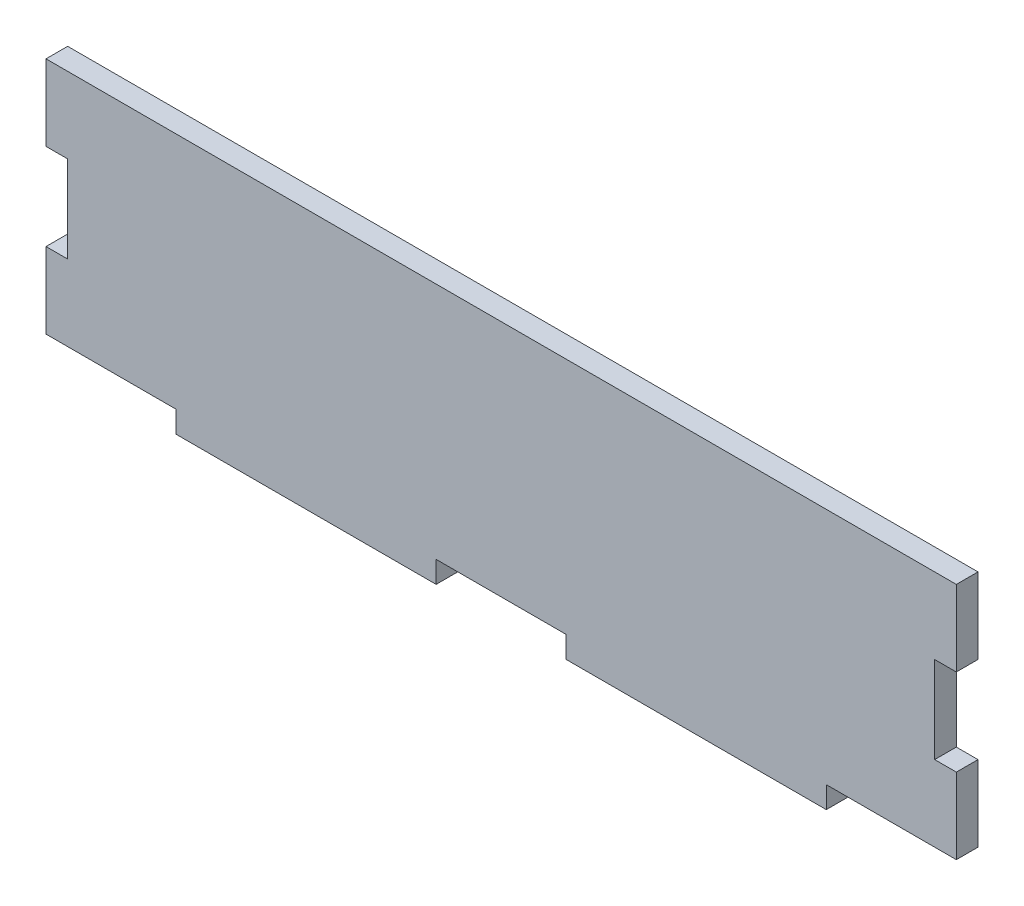
ISO-10303-21;
HEADER;
FILE_DESCRIPTION(('STEP AP214'),'2;1');
FILE_NAME('part.step','',(''),(''),'','','');
FILE_SCHEMA(('AUTOMOTIVE_DESIGN { 1 0 10303 214 1 1 1 1 }'));
ENDSEC;
DATA;
#1=APPLICATION_CONTEXT('core data for automotive mechanical design processes');
#2=APPLICATION_PROTOCOL_DEFINITION('international standard','automotive_design',2000,#1);
#3=PRODUCT_CONTEXT('',#1,'mechanical');
#4=PRODUCT('Part','Part','',(#3));
#5=PRODUCT_RELATED_PRODUCT_CATEGORY('part','',(#4));
#6=PRODUCT_DEFINITION_FORMATION('','',#4);
#7=PRODUCT_DEFINITION_CONTEXT('part definition',#1,'design');
#8=PRODUCT_DEFINITION('design','',#6,#7);
#9=PRODUCT_DEFINITION_SHAPE('','',#8);
#10=(LENGTH_UNIT() NAMED_UNIT(*) SI_UNIT(.MILLI.,.METRE.));
#11=(NAMED_UNIT(*) PLANE_ANGLE_UNIT() SI_UNIT($,.RADIAN.));
#12=(NAMED_UNIT(*) SI_UNIT($,.STERADIAN.) SOLID_ANGLE_UNIT());
#13=UNCERTAINTY_MEASURE_WITH_UNIT(LENGTH_MEASURE(1.E-05),#10,'distance_accuracy_value','');
#14=(GEOMETRIC_REPRESENTATION_CONTEXT(3) GLOBAL_UNCERTAINTY_ASSIGNED_CONTEXT((#13)) GLOBAL_UNIT_ASSIGNED_CONTEXT((#10,
#11,#12)) REPRESENTATION_CONTEXT('',''));
#15=CARTESIAN_POINT('',(0.,0.,0.));
#16=DIRECTION('',(0.,0.,1.));
#17=DIRECTION('',(1.,0.,0.));
#18=AXIS2_PLACEMENT_3D('',#15,#16,#17);
#19=CARTESIAN_POINT('',(-54.7162979436206,-188.545091650223,5.));
#20=DIRECTION('',(1.,0.,0.));
#21=DIRECTION('',(0.,0.,-1.));
#22=AXIS2_PLACEMENT_3D('',#19,#20,#21);
#23=PLANE('',#22);
#24=DIRECTION('',(0.,-1.,0.));
#25=VECTOR('',#24,1.);
#26=CARTESIAN_POINT('',(-54.7162979436206,-188.545091650223,0.));
#27=LINE('',#26,#25);
#28=CARTESIAN_POINT('',(-54.7162979436206,-171.045091650223,0.));
#29=VERTEX_POINT('',#28);
#30=CARTESIAN_POINT('',(-54.7162979436206,-188.545091650223,0.));
#31=VERTEX_POINT('',#30);
#32=EDGE_CURVE('E204',#29,#31,#27,.T.);
#33=ORIENTED_EDGE('',*,*,#32,.T.);
#34=DIRECTION('',(0.,0.,-1.));
#35=VECTOR('',#34,1.);
#36=CARTESIAN_POINT('',(-54.7162979436206,-188.545091650223,5.));
#37=LINE('',#36,#35);
#38=CARTESIAN_POINT('',(-54.7162979436206,-188.545091650223,5.));
#39=VERTEX_POINT('',#38);
#40=EDGE_CURVE('E11',#39,#31,#37,.T.);
#41=ORIENTED_EDGE('',*,*,#40,.F.);
#42=DIRECTION('',(0.,-1.,0.));
#43=VECTOR('',#42,1.);
#44=CARTESIAN_POINT('',(-54.7162979436206,-188.545091650223,5.));
#45=LINE('',#44,#43);
#46=CARTESIAN_POINT('',(-54.7162979436206,-171.045091650223,5.));
#47=VERTEX_POINT('',#46);
#48=EDGE_CURVE('E242',#47,#39,#45,.T.);
#49=ORIENTED_EDGE('',*,*,#48,.F.);
#50=DIRECTION('',(0.,0.,-1.));
#51=VECTOR('',#50,1.);
#52=CARTESIAN_POINT('',(-54.7162979436206,-171.045091650223,5.));
#53=LINE('',#52,#51);
#54=EDGE_CURVE('E200',#47,#29,#53,.T.);
#55=ORIENTED_EDGE('',*,*,#54,.T.);
#56=EDGE_LOOP('',(#33,#41,#49,#55));
#57=FACE_BOUND('',#56,.T.);
#58=ADVANCED_FACE('F36',(#57),#23,.F.);
#59=CARTESIAN_POINT('',(-49.7162979436206,-188.545091650223,5.));
#60=DIRECTION('',(0.,1.,0.));
#61=DIRECTION('',(0.,0.,1.));
#62=AXIS2_PLACEMENT_3D('',#59,#60,#61);
#63=PLANE('',#62);
#64=DIRECTION('',(1.,0.,0.));
#65=VECTOR('',#64,1.);
#66=CARTESIAN_POINT('',(-49.7162979436206,-188.545091650223,0.));
#67=LINE('',#66,#65);
#68=CARTESIAN_POINT('',(-49.7162979436206,-188.545091650223,0.));
#69=VERTEX_POINT('',#68);
#70=EDGE_CURVE('E207',#31,#69,#67,.T.);
#71=ORIENTED_EDGE('',*,*,#70,.T.);
#72=DIRECTION('',(0.,0.,-1.));
#73=VECTOR('',#72,1.);
#74=CARTESIAN_POINT('',(-49.7162979436206,-188.545091650223,5.));
#75=LINE('',#74,#73);
#76=CARTESIAN_POINT('',(-49.7162979436206,-188.545091650223,5.));
#77=VERTEX_POINT('',#76);
#78=EDGE_CURVE('E44',#77,#69,#75,.T.);
#79=ORIENTED_EDGE('',*,*,#78,.F.);
#80=DIRECTION('',(1.,0.,0.));
#81=VECTOR('',#80,1.);
#82=CARTESIAN_POINT('',(-49.7162979436206,-188.545091650223,5.));
#83=LINE('',#82,#81);
#84=EDGE_CURVE('E131',#39,#77,#83,.T.);
#85=ORIENTED_EDGE('',*,*,#84,.F.);
#86=ORIENTED_EDGE('',*,*,#40,.T.);
#87=EDGE_LOOP('',(#71,#79,#85,#86));
#88=FACE_BOUND('',#87,.T.);
#89=ADVANCED_FACE('F360',(#88),#63,.F.);
#90=CARTESIAN_POINT('',(-49.7162979436206,-208.545091650223,5.));
#91=DIRECTION('',(1.,0.,0.));
#92=DIRECTION('',(0.,0.,-1.));
#93=AXIS2_PLACEMENT_3D('',#90,#91,#92);
#94=PLANE('',#93);
#95=DIRECTION('',(0.,-1.,0.));
#96=VECTOR('',#95,1.);
#97=CARTESIAN_POINT('',(-49.7162979436206,-208.545091650223,0.));
#98=LINE('',#97,#96);
#99=CARTESIAN_POINT('',(-49.7162979436206,-208.545091650223,0.));
#100=VERTEX_POINT('',#99);
#101=EDGE_CURVE('E209',#69,#100,#98,.T.);
#102=ORIENTED_EDGE('',*,*,#101,.T.);
#103=DIRECTION('',(0.,0.,-1.));
#104=VECTOR('',#103,1.);
#105=CARTESIAN_POINT('',(-49.7162979436206,-208.545091650223,5.));
#106=LINE('',#105,#104);
#107=CARTESIAN_POINT('',(-49.7162979436206,-208.545091650223,5.));
#108=VERTEX_POINT('',#107);
#109=EDGE_CURVE('E285',#108,#100,#106,.T.);
#110=ORIENTED_EDGE('',*,*,#109,.F.);
#111=DIRECTION('',(0.,-1.,0.));
#112=VECTOR('',#111,1.);
#113=CARTESIAN_POINT('',(-49.7162979436206,-208.545091650223,5.));
#114=LINE('',#113,#112);
#115=EDGE_CURVE('E293',#77,#108,#114,.T.);
#116=ORIENTED_EDGE('',*,*,#115,.F.);
#117=ORIENTED_EDGE('',*,*,#78,.T.);
#118=EDGE_LOOP('',(#102,#110,#116,#117));
#119=FACE_BOUND('',#118,.T.);
#120=ADVANCED_FACE('F291',(#119),#94,.F.);
#121=CARTESIAN_POINT('',(-54.7162979436206,-208.545091650223,5.));
#122=DIRECTION('',(0.,-1.,0.));
#123=DIRECTION('',(0.,0.,-1.));
#124=AXIS2_PLACEMENT_3D('',#121,#122,#123);
#125=PLANE('',#124);
#126=DIRECTION('',(-1.,0.,0.));
#127=VECTOR('',#126,1.);
#128=CARTESIAN_POINT('',(-54.7162979436206,-208.545091650223,0.));
#129=LINE('',#128,#127);
#130=CARTESIAN_POINT('',(-54.7162979436206,-208.545091650223,0.));
#131=VERTEX_POINT('',#130);
#132=EDGE_CURVE('E211',#100,#131,#129,.T.);
#133=ORIENTED_EDGE('',*,*,#132,.T.);
#134=DIRECTION('',(0.,0.,-1.));
#135=VECTOR('',#134,1.);
#136=CARTESIAN_POINT('',(-54.7162979436206,-208.545091650223,5.));
#137=LINE('',#136,#135);
#138=CARTESIAN_POINT('',(-54.7162979436206,-208.545091650223,5.));
#139=VERTEX_POINT('',#138);
#140=EDGE_CURVE('E282',#139,#131,#137,.T.);
#141=ORIENTED_EDGE('',*,*,#140,.F.);
#142=DIRECTION('',(-1.,0.,0.));
#143=VECTOR('',#142,1.);
#144=CARTESIAN_POINT('',(-54.7162979436206,-208.545091650223,5.));
#145=LINE('',#144,#143);
#146=EDGE_CURVE('E311',#108,#139,#145,.T.);
#147=ORIENTED_EDGE('',*,*,#146,.F.);
#148=ORIENTED_EDGE('',*,*,#109,.T.);
#149=EDGE_LOOP('',(#133,#141,#147,#148));
#150=FACE_BOUND('',#149,.T.);
#151=ADVANCED_FACE('F302',(#150),#125,.F.);
#152=CARTESIAN_POINT('',(-54.7162979436206,-226.045091650223,5.));
#153=DIRECTION('',(1.,0.,0.));
#154=DIRECTION('',(0.,0.,-1.));
#155=AXIS2_PLACEMENT_3D('',#152,#153,#154);
#156=PLANE('',#155);
#157=DIRECTION('',(0.,-1.,0.));
#158=VECTOR('',#157,1.);
#159=CARTESIAN_POINT('',(-54.7162979436206,-226.045091650223,0.));
#160=LINE('',#159,#158);
#161=CARTESIAN_POINT('',(-54.7162979436206,-226.045091650223,0.));
#162=VERTEX_POINT('',#161);
#163=EDGE_CURVE('E213',#131,#162,#160,.T.);
#164=ORIENTED_EDGE('',*,*,#163,.T.);
#165=DIRECTION('',(0.,0.,-1.));
#166=VECTOR('',#165,1.);
#167=CARTESIAN_POINT('',(-54.7162979436206,-226.045091650223,5.));
#168=LINE('',#167,#166);
#169=CARTESIAN_POINT('',(-54.7162979436206,-226.045091650223,5.));
#170=VERTEX_POINT('',#169);
#171=EDGE_CURVE('E279',#170,#162,#168,.T.);
#172=ORIENTED_EDGE('',*,*,#171,.F.);
#173=DIRECTION('',(0.,-1.,0.));
#174=VECTOR('',#173,1.);
#175=CARTESIAN_POINT('',(-54.7162979436206,-226.045091650223,5.));
#176=LINE('',#175,#174);
#177=EDGE_CURVE('E308',#139,#170,#176,.T.);
#178=ORIENTED_EDGE('',*,*,#177,.F.);
#179=ORIENTED_EDGE('',*,*,#140,.T.);
#180=EDGE_LOOP('',(#164,#172,#178,#179));
#181=FACE_BOUND('',#180,.T.);
#182=ADVANCED_FACE('F306',(#181),#156,.F.);
#183=CARTESIAN_POINT('',(-24.7162979436206,-226.045091650223,5.));
#184=DIRECTION('',(0.,1.,0.));
#185=DIRECTION('',(0.,0.,1.));
#186=AXIS2_PLACEMENT_3D('',#183,#184,#185);
#187=PLANE('',#186);
#188=DIRECTION('',(1.,0.,0.));
#189=VECTOR('',#188,1.);
#190=CARTESIAN_POINT('',(-24.7162979436206,-226.045091650223,0.));
#191=LINE('',#190,#189);
#192=CARTESIAN_POINT('',(-24.7162979436206,-226.045091650223,0.));
#193=VERTEX_POINT('',#192);
#194=EDGE_CURVE('E215',#162,#193,#191,.T.);
#195=ORIENTED_EDGE('',*,*,#194,.T.);
#196=DIRECTION('',(0.,0.,-1.));
#197=VECTOR('',#196,1.);
#198=CARTESIAN_POINT('',(-24.7162979436206,-226.045091650223,5.));
#199=LINE('',#198,#197);
#200=CARTESIAN_POINT('',(-24.7162979436206,-226.045091650223,5.));
#201=VERTEX_POINT('',#200);
#202=EDGE_CURVE('E276',#201,#193,#199,.T.);
#203=ORIENTED_EDGE('',*,*,#202,.F.);
#204=DIRECTION('',(1.,0.,0.));
#205=VECTOR('',#204,1.);
#206=CARTESIAN_POINT('',(-24.7162979436206,-226.045091650223,5.));
#207=LINE('',#206,#205);
#208=EDGE_CURVE('E310',#170,#201,#207,.T.);
#209=ORIENTED_EDGE('',*,*,#208,.F.);
#210=ORIENTED_EDGE('',*,*,#171,.T.);
#211=EDGE_LOOP('',(#195,#203,#209,#210));
#212=FACE_BOUND('',#211,.T.);
#213=ADVANCED_FACE('F373',(#212),#187,.F.);
#214=CARTESIAN_POINT('',(-24.7162979436206,-231.045091650223,5.));
#215=DIRECTION('',(1.,0.,0.));
#216=DIRECTION('',(0.,0.,-1.));
#217=AXIS2_PLACEMENT_3D('',#214,#215,#216);
#218=PLANE('',#217);
#219=DIRECTION('',(0.,-1.,0.));
#220=VECTOR('',#219,1.);
#221=CARTESIAN_POINT('',(-24.7162979436206,-231.045091650223,0.));
#222=LINE('',#221,#220);
#223=CARTESIAN_POINT('',(-24.7162979436206,-231.045091650223,0.));
#224=VERTEX_POINT('',#223);
#225=EDGE_CURVE('E217',#193,#224,#222,.T.);
#226=ORIENTED_EDGE('',*,*,#225,.T.);
#227=DIRECTION('',(0.,0.,-1.));
#228=VECTOR('',#227,1.);
#229=CARTESIAN_POINT('',(-24.7162979436206,-231.045091650223,5.));
#230=LINE('',#229,#228);
#231=CARTESIAN_POINT('',(-24.7162979436206,-231.045091650223,5.));
#232=VERTEX_POINT('',#231);
#233=EDGE_CURVE('E273',#232,#224,#230,.T.);
#234=ORIENTED_EDGE('',*,*,#233,.F.);
#235=DIRECTION('',(0.,-1.,0.));
#236=VECTOR('',#235,1.);
#237=CARTESIAN_POINT('',(-24.7162979436206,-231.045091650223,5.));
#238=LINE('',#237,#236);
#239=EDGE_CURVE('E313',#201,#232,#238,.T.);
#240=ORIENTED_EDGE('',*,*,#239,.F.);
#241=ORIENTED_EDGE('',*,*,#202,.T.);
#242=EDGE_LOOP('',(#226,#234,#240,#241));
#243=FACE_BOUND('',#242,.T.);
#244=ADVANCED_FACE('F376',(#243),#218,.F.);
#245=CARTESIAN_POINT('',(35.2837020563794,-231.045091650223,5.));
#246=DIRECTION('',(0.,1.,0.));
#247=DIRECTION('',(0.,0.,1.));
#248=AXIS2_PLACEMENT_3D('',#245,#246,#247);
#249=PLANE('',#248);
#250=DIRECTION('',(1.,0.,0.));
#251=VECTOR('',#250,1.);
#252=CARTESIAN_POINT('',(35.2837020563794,-231.045091650223,0.));
#253=LINE('',#252,#251);
#254=CARTESIAN_POINT('',(35.2837020563794,-231.045091650223,0.));
#255=VERTEX_POINT('',#254);
#256=EDGE_CURVE('E219',#224,#255,#253,.T.);
#257=ORIENTED_EDGE('',*,*,#256,.T.);
#258=DIRECTION('',(0.,0.,-1.));
#259=VECTOR('',#258,1.);
#260=CARTESIAN_POINT('',(35.2837020563794,-231.045091650223,5.));
#261=LINE('',#260,#259);
#262=CARTESIAN_POINT('',(35.2837020563794,-231.045091650223,5.));
#263=VERTEX_POINT('',#262);
#264=EDGE_CURVE('E270',#263,#255,#261,.T.);
#265=ORIENTED_EDGE('',*,*,#264,.F.);
#266=DIRECTION('',(1.,0.,0.));
#267=VECTOR('',#266,1.);
#268=CARTESIAN_POINT('',(35.2837020563794,-231.045091650223,5.));
#269=LINE('',#268,#267);
#270=EDGE_CURVE('E319',#232,#263,#269,.T.);
#271=ORIENTED_EDGE('',*,*,#270,.F.);
#272=ORIENTED_EDGE('',*,*,#233,.T.);
#273=EDGE_LOOP('',(#257,#265,#271,#272));
#274=FACE_BOUND('',#273,.T.);
#275=ADVANCED_FACE('F380',(#274),#249,.F.);
#276=CARTESIAN_POINT('',(35.2837020563794,-226.045091650223,5.));
#277=DIRECTION('',(-1.,0.,0.));
#278=DIRECTION('',(0.,0.,1.));
#279=AXIS2_PLACEMENT_3D('',#276,#277,#278);
#280=PLANE('',#279);
#281=DIRECTION('',(0.,1.,0.));
#282=VECTOR('',#281,1.);
#283=CARTESIAN_POINT('',(35.2837020563794,-226.045091650223,0.));
#284=LINE('',#283,#282);
#285=CARTESIAN_POINT('',(35.2837020563794,-226.045091650223,0.));
#286=VERTEX_POINT('',#285);
#287=EDGE_CURVE('E221',#255,#286,#284,.T.);
#288=ORIENTED_EDGE('',*,*,#287,.T.);
#289=DIRECTION('',(0.,0.,-1.));
#290=VECTOR('',#289,1.);
#291=CARTESIAN_POINT('',(35.2837020563794,-226.045091650223,5.));
#292=LINE('',#291,#290);
#293=CARTESIAN_POINT('',(35.2837020563794,-226.045091650223,5.));
#294=VERTEX_POINT('',#293);
#295=EDGE_CURVE('E267',#294,#286,#292,.T.);
#296=ORIENTED_EDGE('',*,*,#295,.F.);
#297=DIRECTION('',(0.,1.,0.));
#298=VECTOR('',#297,1.);
#299=CARTESIAN_POINT('',(35.2837020563794,-226.045091650223,5.));
#300=LINE('',#299,#298);
#301=EDGE_CURVE('E321',#263,#294,#300,.T.);
#302=ORIENTED_EDGE('',*,*,#301,.F.);
#303=ORIENTED_EDGE('',*,*,#264,.T.);
#304=EDGE_LOOP('',(#288,#296,#302,#303));
#305=FACE_BOUND('',#304,.T.);
#306=ADVANCED_FACE('F384',(#305),#280,.F.);
#307=CARTESIAN_POINT('',(65.2837020563794,-226.045091650223,5.));
#308=DIRECTION('',(0.,1.,0.));
#309=DIRECTION('',(0.,0.,1.));
#310=AXIS2_PLACEMENT_3D('',#307,#308,#309);
#311=PLANE('',#310);
#312=DIRECTION('',(1.,0.,0.));
#313=VECTOR('',#312,1.);
#314=CARTESIAN_POINT('',(65.2837020563794,-226.045091650223,0.));
#315=LINE('',#314,#313);
#316=CARTESIAN_POINT('',(65.2837020563794,-226.045091650223,0.));
#317=VERTEX_POINT('',#316);
#318=EDGE_CURVE('E223',#286,#317,#315,.T.);
#319=ORIENTED_EDGE('',*,*,#318,.T.);
#320=DIRECTION('',(0.,0.,-1.));
#321=VECTOR('',#320,1.);
#322=CARTESIAN_POINT('',(65.2837020563794,-226.045091650223,5.));
#323=LINE('',#322,#321);
#324=CARTESIAN_POINT('',(65.2837020563794,-226.045091650223,5.));
#325=VERTEX_POINT('',#324);
#326=EDGE_CURVE('E264',#325,#317,#323,.T.);
#327=ORIENTED_EDGE('',*,*,#326,.F.);
#328=DIRECTION('',(1.,0.,0.));
#329=VECTOR('',#328,1.);
#330=CARTESIAN_POINT('',(65.2837020563794,-226.045091650223,5.));
#331=LINE('',#330,#329);
#332=EDGE_CURVE('E323',#294,#325,#331,.T.);
#333=ORIENTED_EDGE('',*,*,#332,.F.);
#334=ORIENTED_EDGE('',*,*,#295,.T.);
#335=EDGE_LOOP('',(#319,#327,#333,#334));
#336=FACE_BOUND('',#335,.T.);
#337=ADVANCED_FACE('F388',(#336),#311,.F.);
#338=CARTESIAN_POINT('',(65.2837020563794,-231.045091650223,5.));
#339=DIRECTION('',(1.,0.,0.));
#340=DIRECTION('',(0.,0.,-1.));
#341=AXIS2_PLACEMENT_3D('',#338,#339,#340);
#342=PLANE('',#341);
#343=DIRECTION('',(0.,-1.,0.));
#344=VECTOR('',#343,1.);
#345=CARTESIAN_POINT('',(65.2837020563794,-231.045091650223,0.));
#346=LINE('',#345,#344);
#347=CARTESIAN_POINT('',(65.2837020563794,-231.045091650223,0.));
#348=VERTEX_POINT('',#347);
#349=EDGE_CURVE('E225',#317,#348,#346,.T.);
#350=ORIENTED_EDGE('',*,*,#349,.T.);
#351=DIRECTION('',(0.,0.,-1.));
#352=VECTOR('',#351,1.);
#353=CARTESIAN_POINT('',(65.2837020563794,-231.045091650223,5.));
#354=LINE('',#353,#352);
#355=CARTESIAN_POINT('',(65.2837020563794,-231.045091650223,5.));
#356=VERTEX_POINT('',#355);
#357=EDGE_CURVE('E261',#356,#348,#354,.T.);
#358=ORIENTED_EDGE('',*,*,#357,.F.);
#359=DIRECTION('',(0.,-1.,0.));
#360=VECTOR('',#359,1.);
#361=CARTESIAN_POINT('',(65.2837020563794,-231.045091650223,5.));
#362=LINE('',#361,#360);
#363=EDGE_CURVE('E325',#325,#356,#362,.T.);
#364=ORIENTED_EDGE('',*,*,#363,.F.);
#365=ORIENTED_EDGE('',*,*,#326,.T.);
#366=EDGE_LOOP('',(#350,#358,#364,#365));
#367=FACE_BOUND('',#366,.T.);
#368=ADVANCED_FACE('F392',(#367),#342,.F.);
#369=CARTESIAN_POINT('',(125.283702056379,-231.045091650223,5.));
#370=DIRECTION('',(0.,1.,0.));
#371=DIRECTION('',(0.,0.,1.));
#372=AXIS2_PLACEMENT_3D('',#369,#370,#371);
#373=PLANE('',#372);
#374=DIRECTION('',(1.,0.,0.));
#375=VECTOR('',#374,1.);
#376=CARTESIAN_POINT('',(125.283702056379,-231.045091650223,0.));
#377=LINE('',#376,#375);
#378=CARTESIAN_POINT('',(125.283702056379,-231.045091650223,0.));
#379=VERTEX_POINT('',#378);
#380=EDGE_CURVE('E227',#348,#379,#377,.T.);
#381=ORIENTED_EDGE('',*,*,#380,.T.);
#382=DIRECTION('',(0.,0.,-1.));
#383=VECTOR('',#382,1.);
#384=CARTESIAN_POINT('',(125.283702056379,-231.045091650223,5.));
#385=LINE('',#384,#383);
#386=CARTESIAN_POINT('',(125.283702056379,-231.045091650223,5.));
#387=VERTEX_POINT('',#386);
#388=EDGE_CURVE('E258',#387,#379,#385,.T.);
#389=ORIENTED_EDGE('',*,*,#388,.F.);
#390=DIRECTION('',(1.,0.,0.));
#391=VECTOR('',#390,1.);
#392=CARTESIAN_POINT('',(125.283702056379,-231.045091650223,5.));
#393=LINE('',#392,#391);
#394=EDGE_CURVE('E327',#356,#387,#393,.T.);
#395=ORIENTED_EDGE('',*,*,#394,.F.);
#396=ORIENTED_EDGE('',*,*,#357,.T.);
#397=EDGE_LOOP('',(#381,#389,#395,#396));
#398=FACE_BOUND('',#397,.T.);
#399=ADVANCED_FACE('F396',(#398),#373,.F.);
#400=CARTESIAN_POINT('',(125.283702056379,-226.045091650223,5.));
#401=DIRECTION('',(-1.,0.,0.));
#402=DIRECTION('',(0.,0.,1.));
#403=AXIS2_PLACEMENT_3D('',#400,#401,#402);
#404=PLANE('',#403);
#405=DIRECTION('',(0.,1.,0.));
#406=VECTOR('',#405,1.);
#407=CARTESIAN_POINT('',(125.283702056379,-226.045091650223,0.));
#408=LINE('',#407,#406);
#409=CARTESIAN_POINT('',(125.283702056379,-226.045091650223,0.));
#410=VERTEX_POINT('',#409);
#411=EDGE_CURVE('E229',#379,#410,#408,.T.);
#412=ORIENTED_EDGE('',*,*,#411,.T.);
#413=DIRECTION('',(0.,0.,-1.));
#414=VECTOR('',#413,1.);
#415=CARTESIAN_POINT('',(125.283702056379,-226.045091650223,5.));
#416=LINE('',#415,#414);
#417=CARTESIAN_POINT('',(125.283702056379,-226.045091650223,5.));
#418=VERTEX_POINT('',#417);
#419=EDGE_CURVE('E255',#418,#410,#416,.T.);
#420=ORIENTED_EDGE('',*,*,#419,.F.);
#421=DIRECTION('',(0.,1.,0.));
#422=VECTOR('',#421,1.);
#423=CARTESIAN_POINT('',(125.283702056379,-226.045091650223,5.));
#424=LINE('',#423,#422);
#425=EDGE_CURVE('E329',#387,#418,#424,.T.);
#426=ORIENTED_EDGE('',*,*,#425,.F.);
#427=ORIENTED_EDGE('',*,*,#388,.T.);
#428=EDGE_LOOP('',(#412,#420,#426,#427));
#429=FACE_BOUND('',#428,.T.);
#430=ADVANCED_FACE('F400',(#429),#404,.F.);
#431=CARTESIAN_POINT('',(155.283702056379,-226.045091650223,5.));
#432=DIRECTION('',(0.,1.,0.));
#433=DIRECTION('',(0.,0.,1.));
#434=AXIS2_PLACEMENT_3D('',#431,#432,#433);
#435=PLANE('',#434);
#436=DIRECTION('',(1.,0.,0.));
#437=VECTOR('',#436,1.);
#438=CARTESIAN_POINT('',(155.283702056379,-226.045091650223,0.));
#439=LINE('',#438,#437);
#440=CARTESIAN_POINT('',(155.283702056379,-226.045091650223,0.));
#441=VERTEX_POINT('',#440);
#442=EDGE_CURVE('E231',#410,#441,#439,.T.);
#443=ORIENTED_EDGE('',*,*,#442,.T.);
#444=DIRECTION('',(0.,0.,-1.));
#445=VECTOR('',#444,1.);
#446=CARTESIAN_POINT('',(155.283702056379,-226.045091650223,5.));
#447=LINE('',#446,#445);
#448=CARTESIAN_POINT('',(155.283702056379,-226.045091650223,5.));
#449=VERTEX_POINT('',#448);
#450=EDGE_CURVE('E252',#449,#441,#447,.T.);
#451=ORIENTED_EDGE('',*,*,#450,.F.);
#452=DIRECTION('',(1.,0.,0.));
#453=VECTOR('',#452,1.);
#454=CARTESIAN_POINT('',(155.283702056379,-226.045091650223,5.));
#455=LINE('',#454,#453);
#456=EDGE_CURVE('E331',#418,#449,#455,.T.);
#457=ORIENTED_EDGE('',*,*,#456,.F.);
#458=ORIENTED_EDGE('',*,*,#419,.T.);
#459=EDGE_LOOP('',(#443,#451,#457,#458));
#460=FACE_BOUND('',#459,.T.);
#461=ADVANCED_FACE('F404',(#460),#435,.F.);
#462=CARTESIAN_POINT('',(155.283702056379,-208.545091650223,5.));
#463=DIRECTION('',(-1.,0.,0.));
#464=DIRECTION('',(0.,-1.,0.));
#465=AXIS2_PLACEMENT_3D('',#462,#463,#464);
#466=PLANE('',#465);
#467=DIRECTION('',(0.,1.,0.));
#468=VECTOR('',#467,1.);
#469=CARTESIAN_POINT('',(155.283702056379,-208.545091650223,0.));
#470=LINE('',#469,#468);
#471=CARTESIAN_POINT('',(155.283702056379,-208.545091650223,0.));
#472=VERTEX_POINT('',#471);
#473=EDGE_CURVE('E233',#441,#472,#470,.T.);
#474=ORIENTED_EDGE('',*,*,#473,.T.);
#475=DIRECTION('',(0.,0.,-1.));
#476=VECTOR('',#475,1.);
#477=CARTESIAN_POINT('',(155.283702056379,-208.545091650223,5.));
#478=LINE('',#477,#476);
#479=CARTESIAN_POINT('',(155.283702056379,-208.545091650223,5.));
#480=VERTEX_POINT('',#479);
#481=EDGE_CURVE('E249',#480,#472,#478,.T.);
#482=ORIENTED_EDGE('',*,*,#481,.F.);
#483=DIRECTION('',(0.,1.,0.));
#484=VECTOR('',#483,1.);
#485=CARTESIAN_POINT('',(155.283702056379,-208.545091650223,5.));
#486=LINE('',#485,#484);
#487=EDGE_CURVE('E333',#449,#480,#486,.T.);
#488=ORIENTED_EDGE('',*,*,#487,.F.);
#489=ORIENTED_EDGE('',*,*,#450,.T.);
#490=EDGE_LOOP('',(#474,#482,#488,#489));
#491=FACE_BOUND('',#490,.T.);
#492=ADVANCED_FACE('F408',(#491),#466,.F.);
#493=CARTESIAN_POINT('',(150.283702056379,-208.545091650223,5.));
#494=DIRECTION('',(0.,-1.,0.));
#495=DIRECTION('',(0.,0.,-1.));
#496=AXIS2_PLACEMENT_3D('',#493,#494,#495);
#497=PLANE('',#496);
#498=DIRECTION('',(-1.,0.,0.));
#499=VECTOR('',#498,1.);
#500=CARTESIAN_POINT('',(150.283702056379,-208.545091650223,0.));
#501=LINE('',#500,#499);
#502=CARTESIAN_POINT('',(150.283702056379,-208.545091650223,0.));
#503=VERTEX_POINT('',#502);
#504=EDGE_CURVE('E235',#472,#503,#501,.T.);
#505=ORIENTED_EDGE('',*,*,#504,.T.);
#506=DIRECTION('',(0.,0.,-1.));
#507=VECTOR('',#506,1.);
#508=CARTESIAN_POINT('',(150.283702056379,-208.545091650223,5.));
#509=LINE('',#508,#507);
#510=CARTESIAN_POINT('',(150.283702056379,-208.545091650223,5.));
#511=VERTEX_POINT('',#510);
#512=EDGE_CURVE('E246',#511,#503,#509,.T.);
#513=ORIENTED_EDGE('',*,*,#512,.F.);
#514=DIRECTION('',(-1.,0.,0.));
#515=VECTOR('',#514,1.);
#516=CARTESIAN_POINT('',(150.283702056379,-208.545091650223,5.));
#517=LINE('',#516,#515);
#518=EDGE_CURVE('E335',#480,#511,#517,.T.);
#519=ORIENTED_EDGE('',*,*,#518,.F.);
#520=ORIENTED_EDGE('',*,*,#481,.T.);
#521=EDGE_LOOP('',(#505,#513,#519,#520));
#522=FACE_BOUND('',#521,.T.);
#523=ADVANCED_FACE('F341',(#522),#497,.F.);
#524=CARTESIAN_POINT('',(150.283702056379,-188.545091650223,5.));
#525=DIRECTION('',(-1.,0.,0.));
#526=DIRECTION('',(0.,0.,1.));
#527=AXIS2_PLACEMENT_3D('',#524,#525,#526);
#528=PLANE('',#527);
#529=DIRECTION('',(0.,1.,0.));
#530=VECTOR('',#529,1.);
#531=CARTESIAN_POINT('',(150.283702056379,-188.545091650223,0.));
#532=LINE('',#531,#530);
#533=CARTESIAN_POINT('',(150.283702056379,-188.545091650223,0.));
#534=VERTEX_POINT('',#533);
#535=EDGE_CURVE('E237',#503,#534,#532,.T.);
#536=ORIENTED_EDGE('',*,*,#535,.T.);
#537=DIRECTION('',(0.,0.,-1.));
#538=VECTOR('',#537,1.);
#539=CARTESIAN_POINT('',(150.283702056379,-188.545091650223,5.));
#540=LINE('',#539,#538);
#541=CARTESIAN_POINT('',(150.283702056379,-188.545091650223,5.));
#542=VERTEX_POINT('',#541);
#543=EDGE_CURVE('E195',#542,#534,#540,.T.);
#544=ORIENTED_EDGE('',*,*,#543,.F.);
#545=DIRECTION('',(0.,1.,0.));
#546=VECTOR('',#545,1.);
#547=CARTESIAN_POINT('',(150.283702056379,-188.545091650223,5.));
#548=LINE('',#547,#546);
#549=EDGE_CURVE('E186',#511,#542,#548,.T.);
#550=ORIENTED_EDGE('',*,*,#549,.F.);
#551=ORIENTED_EDGE('',*,*,#512,.T.);
#552=EDGE_LOOP('',(#536,#544,#550,#551));
#553=FACE_BOUND('',#552,.T.);
#554=ADVANCED_FACE('F345',(#553),#528,.F.);
#555=CARTESIAN_POINT('',(155.283702056379,-188.545091650223,5.));
#556=DIRECTION('',(0.,1.,0.));
#557=DIRECTION('',(0.,0.,1.));
#558=AXIS2_PLACEMENT_3D('',#555,#556,#557);
#559=PLANE('',#558);
#560=DIRECTION('',(1.,0.,0.));
#561=VECTOR('',#560,1.);
#562=CARTESIAN_POINT('',(155.283702056379,-188.545091650223,0.));
#563=LINE('',#562,#561);
#564=CARTESIAN_POINT('',(155.283702056379,-188.545091650223,0.));
#565=VERTEX_POINT('',#564);
#566=EDGE_CURVE('E194',#534,#565,#563,.T.);
#567=ORIENTED_EDGE('',*,*,#566,.T.);
#568=DIRECTION('',(0.,0.,-1.));
#569=VECTOR('',#568,1.);
#570=CARTESIAN_POINT('',(155.283702056379,-188.545091650223,5.));
#571=LINE('',#570,#569);
#572=CARTESIAN_POINT('',(155.283702056379,-188.545091650223,5.));
#573=VERTEX_POINT('',#572);
#574=EDGE_CURVE('E191',#573,#565,#571,.T.);
#575=ORIENTED_EDGE('',*,*,#574,.F.);
#576=DIRECTION('',(1.,0.,0.));
#577=VECTOR('',#576,1.);
#578=CARTESIAN_POINT('',(155.283702056379,-188.545091650223,5.));
#579=LINE('',#578,#577);
#580=EDGE_CURVE('E180',#542,#573,#579,.T.);
#581=ORIENTED_EDGE('',*,*,#580,.F.);
#582=ORIENTED_EDGE('',*,*,#543,.T.);
#583=EDGE_LOOP('',(#567,#575,#581,#582));
#584=FACE_BOUND('',#583,.T.);
#585=ADVANCED_FACE('F192',(#584),#559,.F.);
#586=CARTESIAN_POINT('',(155.283702056379,-171.045091650223,5.));
#587=DIRECTION('',(-1.,0.,0.));
#588=DIRECTION('',(0.,0.,1.));
#589=AXIS2_PLACEMENT_3D('',#586,#587,#588);
#590=PLANE('',#589);
#591=DIRECTION('',(0.,1.,0.));
#592=VECTOR('',#591,1.);
#593=CARTESIAN_POINT('',(155.283702056379,-171.045091650223,0.));
#594=LINE('',#593,#592);
#595=CARTESIAN_POINT('',(155.283702056379,-171.045091650223,0.));
#596=VERTEX_POINT('',#595);
#597=EDGE_CURVE('E117',#565,#596,#594,.T.);
#598=ORIENTED_EDGE('',*,*,#597,.T.);
#599=DIRECTION('',(0.,0.,-1.));
#600=VECTOR('',#599,1.);
#601=CARTESIAN_POINT('',(155.283702056379,-171.045091650223,5.));
#602=LINE('',#601,#600);
#603=CARTESIAN_POINT('',(155.283702056379,-171.045091650223,5.));
#604=VERTEX_POINT('',#603);
#605=EDGE_CURVE('E196',#604,#596,#602,.T.);
#606=ORIENTED_EDGE('',*,*,#605,.F.);
#607=DIRECTION('',(0.,1.,0.));
#608=VECTOR('',#607,1.);
#609=CARTESIAN_POINT('',(155.283702056379,-171.045091650223,5.));
#610=LINE('',#609,#608);
#611=EDGE_CURVE('E184',#573,#604,#610,.T.);
#612=ORIENTED_EDGE('',*,*,#611,.F.);
#613=ORIENTED_EDGE('',*,*,#574,.T.);
#614=EDGE_LOOP('',(#598,#606,#612,#613));
#615=FACE_BOUND('',#614,.T.);
#616=ADVANCED_FACE('F198',(#615),#590,.F.);
#617=CARTESIAN_POINT('',(-54.7162979436206,-171.045091650223,5.));
#618=DIRECTION('',(0.,-1.,0.));
#619=DIRECTION('',(0.,0.,-1.));
#620=AXIS2_PLACEMENT_3D('',#617,#618,#619);
#621=PLANE('',#620);
#622=DIRECTION('',(-1.,0.,0.));
#623=VECTOR('',#622,1.);
#624=CARTESIAN_POINT('',(-54.7162979436206,-171.045091650223,0.));
#625=LINE('',#624,#623);
#626=EDGE_CURVE('E123',#596,#29,#625,.T.);
#627=ORIENTED_EDGE('',*,*,#626,.T.);
#628=ORIENTED_EDGE('',*,*,#54,.F.);
#629=DIRECTION('',(-1.,0.,0.));
#630=VECTOR('',#629,1.);
#631=CARTESIAN_POINT('',(-54.7162979436206,-171.045091650223,5.));
#632=LINE('',#631,#630);
#633=EDGE_CURVE('E52',#604,#47,#632,.T.);
#634=ORIENTED_EDGE('',*,*,#633,.F.);
#635=ORIENTED_EDGE('',*,*,#605,.T.);
#636=EDGE_LOOP('',(#627,#628,#634,#635));
#637=FACE_BOUND('',#636,.T.);
#638=ADVANCED_FACE('F349',(#637),#621,.F.);
#639=CARTESIAN_POINT('',(0.,0.,5.));
#640=DIRECTION('',(0.,0.,-1.));
#641=DIRECTION('',(-1.,0.,0.));
#642=AXIS2_PLACEMENT_3D('',#639,#640,#641);
#643=PLANE('',#642);
#644=ORIENTED_EDGE('',*,*,#48,.T.);
#645=ORIENTED_EDGE('',*,*,#84,.T.);
#646=ORIENTED_EDGE('',*,*,#115,.T.);
#647=ORIENTED_EDGE('',*,*,#146,.T.);
#648=ORIENTED_EDGE('',*,*,#177,.T.);
#649=ORIENTED_EDGE('',*,*,#208,.T.);
#650=ORIENTED_EDGE('',*,*,#239,.T.);
#651=ORIENTED_EDGE('',*,*,#270,.T.);
#652=ORIENTED_EDGE('',*,*,#301,.T.);
#653=ORIENTED_EDGE('',*,*,#332,.T.);
#654=ORIENTED_EDGE('',*,*,#363,.T.);
#655=ORIENTED_EDGE('',*,*,#394,.T.);
#656=ORIENTED_EDGE('',*,*,#425,.T.);
#657=ORIENTED_EDGE('',*,*,#456,.T.);
#658=ORIENTED_EDGE('',*,*,#487,.T.);
#659=ORIENTED_EDGE('',*,*,#518,.T.);
#660=ORIENTED_EDGE('',*,*,#549,.T.);
#661=ORIENTED_EDGE('',*,*,#580,.T.);
#662=ORIENTED_EDGE('',*,*,#611,.T.);
#663=ORIENTED_EDGE('',*,*,#633,.T.);
#664=EDGE_LOOP('',(#644,#645,#646,#647,#648,#649,#650,#651,#652,#653,#654,#655,#656,#657,#658,
#659,#660,#661,#662,#663));
#665=FACE_BOUND('',#664,.T.);
#666=ADVANCED_FACE('F182',(#665),#643,.F.);
#667=CARTESIAN_POINT('',(0.,0.,0.));
#668=DIRECTION('',(0.,0.,-1.));
#669=DIRECTION('',(-1.,0.,0.));
#670=AXIS2_PLACEMENT_3D('',#667,#668,#669);
#671=PLANE('',#670);
#672=ORIENTED_EDGE('',*,*,#32,.F.);
#673=ORIENTED_EDGE('',*,*,#626,.F.);
#674=ORIENTED_EDGE('',*,*,#597,.F.);
#675=ORIENTED_EDGE('',*,*,#566,.F.);
#676=ORIENTED_EDGE('',*,*,#535,.F.);
#677=ORIENTED_EDGE('',*,*,#504,.F.);
#678=ORIENTED_EDGE('',*,*,#473,.F.);
#679=ORIENTED_EDGE('',*,*,#442,.F.);
#680=ORIENTED_EDGE('',*,*,#411,.F.);
#681=ORIENTED_EDGE('',*,*,#380,.F.);
#682=ORIENTED_EDGE('',*,*,#349,.F.);
#683=ORIENTED_EDGE('',*,*,#318,.F.);
#684=ORIENTED_EDGE('',*,*,#287,.F.);
#685=ORIENTED_EDGE('',*,*,#256,.F.);
#686=ORIENTED_EDGE('',*,*,#225,.F.);
#687=ORIENTED_EDGE('',*,*,#194,.F.);
#688=ORIENTED_EDGE('',*,*,#163,.F.);
#689=ORIENTED_EDGE('',*,*,#132,.F.);
#690=ORIENTED_EDGE('',*,*,#101,.F.);
#691=ORIENTED_EDGE('',*,*,#70,.F.);
#692=EDGE_LOOP('',(#672,#673,#674,#675,#676,#677,#678,#679,#680,#681,#682,#683,#684,#685,#686,
#687,#688,#689,#690,#691));
#693=FACE_BOUND('',#692,.T.);
#694=ADVANCED_FACE('F297',(#693),#671,.T.);
#695=CLOSED_SHELL('',(#58,#89,#120,#151,#182,#213,#244,#275,#306,#337,#368,#399,#430,#461,#492,
#523,#554,#585,#616,#638,#666,#694));
#696=MANIFOLD_SOLID_BREP('B2',#695);
#697=ADVANCED_BREP_SHAPE_REPRESENTATION('',(#18,#696),#14);
#698=SHAPE_DEFINITION_REPRESENTATION(#9,#697);
ENDSEC;
END-ISO-10303-21;
